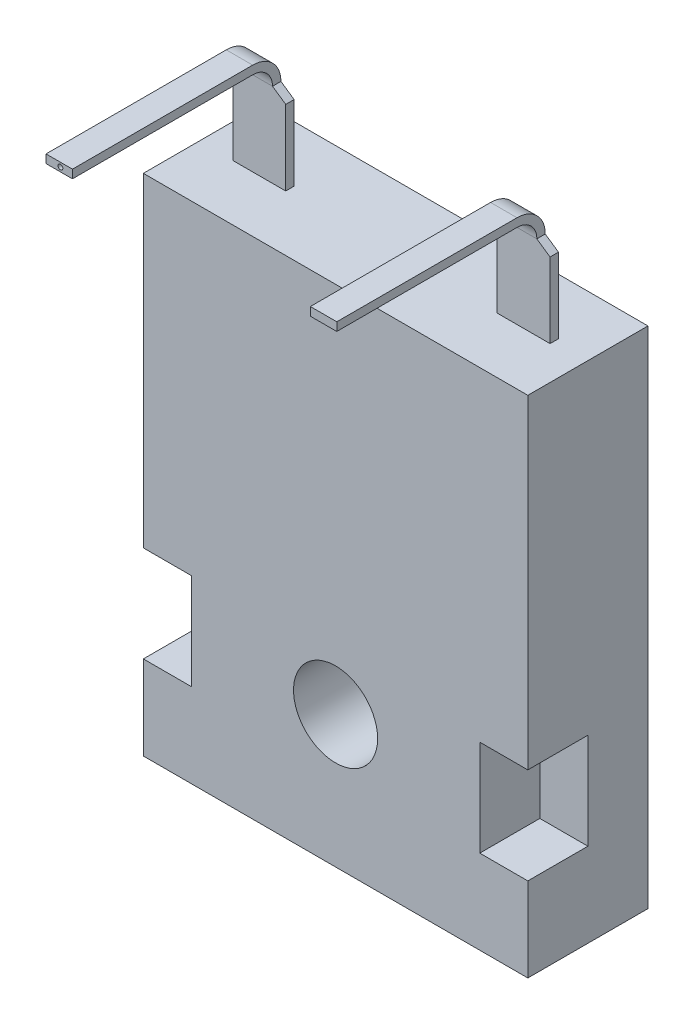
ISO-10303-21;
HEADER;
FILE_DESCRIPTION(('STEP AP214'),'2;1');
FILE_NAME('part.step','',(''),(''),'','','');
FILE_SCHEMA(('AUTOMOTIVE_DESIGN { 1 0 10303 214 1 1 1 1 }'));
ENDSEC;
DATA;
#1=APPLICATION_CONTEXT('core data for automotive mechanical design processes');
#2=APPLICATION_PROTOCOL_DEFINITION('international standard','automotive_design',2000,#1);
#3=PRODUCT_CONTEXT('',#1,'mechanical');
#4=PRODUCT('Part','Part','',(#3));
#5=PRODUCT_RELATED_PRODUCT_CATEGORY('part','',(#4));
#6=PRODUCT_DEFINITION_FORMATION('','',#4);
#7=PRODUCT_DEFINITION_CONTEXT('part definition',#1,'design');
#8=PRODUCT_DEFINITION('design','',#6,#7);
#9=PRODUCT_DEFINITION_SHAPE('','',#8);
#10=(LENGTH_UNIT() NAMED_UNIT(*) SI_UNIT(.MILLI.,.METRE.));
#11=(NAMED_UNIT(*) PLANE_ANGLE_UNIT() SI_UNIT($,.RADIAN.));
#12=(NAMED_UNIT(*) SI_UNIT($,.STERADIAN.) SOLID_ANGLE_UNIT());
#13=UNCERTAINTY_MEASURE_WITH_UNIT(LENGTH_MEASURE(1.E-05),#10,'distance_accuracy_value','');
#14=(GEOMETRIC_REPRESENTATION_CONTEXT(3) GLOBAL_UNCERTAINTY_ASSIGNED_CONTEXT((#13)) GLOBAL_UNIT_ASSIGNED_CONTEXT((#10,
#11,#12)) REPRESENTATION_CONTEXT('',''));
#15=CARTESIAN_POINT('',(0.,0.,0.));
#16=DIRECTION('',(0.,0.,1.));
#17=DIRECTION('',(1.,0.,0.));
#18=AXIS2_PLACEMENT_3D('',#15,#16,#17);
#19=CARTESIAN_POINT('',(-8.,15.5,5.));
#20=DIRECTION('',(0.,0.,-1.));
#21=DIRECTION('',(-1.,0.,0.));
#22=AXIS2_PLACEMENT_3D('',#19,#20,#21);
#23=PLANE('',#22);
#24=CARTESIAN_POINT('',(0.,0.,5.));
#25=DIRECTION('',(0.,0.,1.));
#26=DIRECTION('',(1.,0.,0.));
#27=AXIS2_PLACEMENT_3D('',#24,#25,#26);
#28=CIRCLE('',#27,1.75);
#29=CARTESIAN_POINT('',(1.75,0.,5.));
#30=VERTEX_POINT('',#29);
#31=EDGE_CURVE('E459',#30,#30,#28,.T.);
#32=ORIENTED_EDGE('',*,*,#31,.F.);
#33=EDGE_LOOP('',(#32));
#34=FACE_BOUND('',#33,.T.);
#35=DIRECTION('',(-1.,0.,0.));
#36=VECTOR('',#35,1.);
#37=CARTESIAN_POINT('',(6.,-2.,5.));
#38=LINE('',#37,#36);
#39=CARTESIAN_POINT('',(8.,-2.,5.));
#40=VERTEX_POINT('',#39);
#41=CARTESIAN_POINT('',(6.,-2.,5.));
#42=VERTEX_POINT('',#41);
#43=EDGE_CURVE('E1020',#40,#42,#38,.T.);
#44=ORIENTED_EDGE('',*,*,#43,.T.);
#45=DIRECTION('',(0.,1.,0.));
#46=VECTOR('',#45,1.);
#47=CARTESIAN_POINT('',(6.,-2.,5.));
#48=LINE('',#47,#46);
#49=CARTESIAN_POINT('',(6.,2.,5.));
#50=VERTEX_POINT('',#49);
#51=EDGE_CURVE('E258',#42,#50,#48,.T.);
#52=ORIENTED_EDGE('',*,*,#51,.T.);
#53=DIRECTION('',(1.,0.,0.));
#54=VECTOR('',#53,1.);
#55=CARTESIAN_POINT('',(6.,2.,5.));
#56=LINE('',#55,#54);
#57=CARTESIAN_POINT('',(8.,2.,5.));
#58=VERTEX_POINT('',#57);
#59=EDGE_CURVE('E247',#50,#58,#56,.T.);
#60=ORIENTED_EDGE('',*,*,#59,.T.);
#61=DIRECTION('',(0.,1.,0.));
#62=VECTOR('',#61,1.);
#63=CARTESIAN_POINT('',(8.,-5.5,5.));
#64=LINE('',#63,#62);
#65=CARTESIAN_POINT('',(8.,15.5,5.));
#66=VERTEX_POINT('',#65);
#67=EDGE_CURVE('E479',#58,#66,#64,.T.);
#68=ORIENTED_EDGE('',*,*,#67,.T.);
#69=DIRECTION('',(-1.,0.,0.));
#70=VECTOR('',#69,1.);
#71=CARTESIAN_POINT('',(-8.,15.5,5.));
#72=LINE('',#71,#70);
#73=CARTESIAN_POINT('',(-8.,15.5,5.));
#74=VERTEX_POINT('',#73);
#75=EDGE_CURVE('E466',#66,#74,#72,.T.);
#76=ORIENTED_EDGE('',*,*,#75,.T.);
#77=DIRECTION('',(0.,-1.,0.));
#78=VECTOR('',#77,1.);
#79=CARTESIAN_POINT('',(-7.99999999999999,-5.5,5.));
#80=LINE('',#79,#78);
#81=CARTESIAN_POINT('',(-7.99999999999999,2.,5.));
#82=VERTEX_POINT('',#81);
#83=EDGE_CURVE('E473',#74,#82,#80,.T.);
#84=ORIENTED_EDGE('',*,*,#83,.T.);
#85=DIRECTION('',(1.,0.,0.));
#86=VECTOR('',#85,1.);
#87=CARTESIAN_POINT('',(-6.,2.,5.));
#88=LINE('',#87,#86);
#89=CARTESIAN_POINT('',(-6.,2.,5.));
#90=VERTEX_POINT('',#89);
#91=EDGE_CURVE('E272',#82,#90,#88,.T.);
#92=ORIENTED_EDGE('',*,*,#91,.T.);
#93=DIRECTION('',(0.,-1.,0.));
#94=VECTOR('',#93,1.);
#95=CARTESIAN_POINT('',(-6.,-2.,5.));
#96=LINE('',#95,#94);
#97=CARTESIAN_POINT('',(-6.,-2.,5.));
#98=VERTEX_POINT('',#97);
#99=EDGE_CURVE('E259',#90,#98,#96,.T.);
#100=ORIENTED_EDGE('',*,*,#99,.T.);
#101=DIRECTION('',(-1.,0.,0.));
#102=VECTOR('',#101,1.);
#103=CARTESIAN_POINT('',(-6.,-2.,5.));
#104=LINE('',#103,#102);
#105=CARTESIAN_POINT('',(-7.99999999999999,-2.,5.));
#106=VERTEX_POINT('',#105);
#107=EDGE_CURVE('E263',#98,#106,#104,.T.);
#108=ORIENTED_EDGE('',*,*,#107,.T.);
#109=CARTESIAN_POINT('',(-7.99999999999999,-5.5,5.));
#110=VERTEX_POINT('',#109);
#111=EDGE_CURVE('E471',#106,#110,#80,.T.);
#112=ORIENTED_EDGE('',*,*,#111,.T.);
#113=DIRECTION('',(1.,0.,0.));
#114=VECTOR('',#113,1.);
#115=CARTESIAN_POINT('',(-7.99999999999999,-5.5,5.));
#116=LINE('',#115,#114);
#117=CARTESIAN_POINT('',(8.,-5.5,5.));
#118=VERTEX_POINT('',#117);
#119=EDGE_CURVE('E448',#110,#118,#116,.T.);
#120=ORIENTED_EDGE('',*,*,#119,.T.);
#121=EDGE_CURVE('E480',#118,#40,#64,.T.);
#122=ORIENTED_EDGE('',*,*,#121,.T.);
#123=EDGE_LOOP('',(#44,#52,#60,#68,#76,#84,#92,#100,#108,#112,#120,#122));
#124=FACE_BOUND('',#123,.T.);
#125=ADVANCED_FACE('F33',(#34,#124),#23,.F.);
#126=CARTESIAN_POINT('',(8.,-5.5,5.));
#127=DIRECTION('',(-1.,0.,0.));
#128=DIRECTION('',(0.,0.,1.));
#129=AXIS2_PLACEMENT_3D('',#126,#127,#128);
#130=PLANE('',#129);
#131=DIRECTION('',(0.,0.,-1.));
#132=VECTOR('',#131,1.);
#133=CARTESIAN_POINT('',(8.,-2.,5.));
#134=LINE('',#133,#132);
#135=CARTESIAN_POINT('',(8.,-2.,2.5));
#136=VERTEX_POINT('',#135);
#137=EDGE_CURVE('E11',#40,#136,#134,.T.);
#138=ORIENTED_EDGE('',*,*,#137,.F.);
#139=ORIENTED_EDGE('',*,*,#121,.F.);
#140=DIRECTION('',(0.,0.,-1.));
#141=VECTOR('',#140,1.);
#142=CARTESIAN_POINT('',(8.,-5.5,5.));
#143=LINE('',#142,#141);
#144=CARTESIAN_POINT('',(8.,-5.5,0.));
#145=VERTEX_POINT('',#144);
#146=EDGE_CURVE('E431',#118,#145,#143,.T.);
#147=ORIENTED_EDGE('',*,*,#146,.T.);
#148=DIRECTION('',(0.,1.,0.));
#149=VECTOR('',#148,1.);
#150=CARTESIAN_POINT('',(8.,-5.5,0.));
#151=LINE('',#150,#149);
#152=CARTESIAN_POINT('',(8.,15.5,0.));
#153=VERTEX_POINT('',#152);
#154=EDGE_CURVE('E461',#145,#153,#151,.T.);
#155=ORIENTED_EDGE('',*,*,#154,.T.);
#156=DIRECTION('',(0.,0.,-1.));
#157=VECTOR('',#156,1.);
#158=CARTESIAN_POINT('',(8.,15.5,5.));
#159=LINE('',#158,#157);
#160=EDGE_CURVE('E428',#66,#153,#159,.T.);
#161=ORIENTED_EDGE('',*,*,#160,.F.);
#162=ORIENTED_EDGE('',*,*,#67,.F.);
#163=DIRECTION('',(0.,0.,1.));
#164=VECTOR('',#163,1.);
#165=CARTESIAN_POINT('',(8.,2.,5.));
#166=LINE('',#165,#164);
#167=CARTESIAN_POINT('',(8.,2.,2.5));
#168=VERTEX_POINT('',#167);
#169=EDGE_CURVE('E41',#168,#58,#166,.T.);
#170=ORIENTED_EDGE('',*,*,#169,.F.);
#171=DIRECTION('',(0.,1.,0.));
#172=VECTOR('',#171,1.);
#173=CARTESIAN_POINT('',(8.,-5.5,2.5));
#174=LINE('',#173,#172);
#175=EDGE_CURVE('E508',#136,#168,#174,.T.);
#176=ORIENTED_EDGE('',*,*,#175,.F.);
#177=EDGE_LOOP('',(#138,#139,#147,#155,#161,#162,#170,#176));
#178=FACE_BOUND('',#177,.T.);
#179=ADVANCED_FACE('F490',(#178),#130,.F.);
#180=CARTESIAN_POINT('',(-7.99999999999999,-5.5,5.));
#181=DIRECTION('',(1.,0.,0.));
#182=DIRECTION('',(0.,1.,0.));
#183=AXIS2_PLACEMENT_3D('',#180,#181,#182);
#184=PLANE('',#183);
#185=DIRECTION('',(0.,0.,1.));
#186=VECTOR('',#185,1.);
#187=CARTESIAN_POINT('',(-7.99999999999999,-2.,5.));
#188=LINE('',#187,#186);
#189=CARTESIAN_POINT('',(-7.99999999999999,-2.,2.5));
#190=VERTEX_POINT('',#189);
#191=EDGE_CURVE('E506',#190,#106,#188,.T.);
#192=ORIENTED_EDGE('',*,*,#191,.F.);
#193=DIRECTION('',(0.,-1.,0.));
#194=VECTOR('',#193,1.);
#195=CARTESIAN_POINT('',(-7.99999999999999,-5.5,2.5));
#196=LINE('',#195,#194);
#197=CARTESIAN_POINT('',(-7.99999999999999,2.,2.5));
#198=VERTEX_POINT('',#197);
#199=EDGE_CURVE('E507',#198,#190,#196,.T.);
#200=ORIENTED_EDGE('',*,*,#199,.F.);
#201=DIRECTION('',(0.,0.,-1.));
#202=VECTOR('',#201,1.);
#203=CARTESIAN_POINT('',(-7.99999999999999,2.,5.));
#204=LINE('',#203,#202);
#205=EDGE_CURVE('E496',#82,#198,#204,.T.);
#206=ORIENTED_EDGE('',*,*,#205,.F.);
#207=ORIENTED_EDGE('',*,*,#83,.F.);
#208=DIRECTION('',(0.,0.,-1.));
#209=VECTOR('',#208,1.);
#210=CARTESIAN_POINT('',(-8.,15.5,5.));
#211=LINE('',#210,#209);
#212=CARTESIAN_POINT('',(-8.,15.5,0.));
#213=VERTEX_POINT('',#212);
#214=EDGE_CURVE('E432',#74,#213,#211,.T.);
#215=ORIENTED_EDGE('',*,*,#214,.T.);
#216=DIRECTION('',(0.,-1.,0.));
#217=VECTOR('',#216,1.);
#218=CARTESIAN_POINT('',(-7.99999999999999,-5.5,0.));
#219=LINE('',#218,#217);
#220=CARTESIAN_POINT('',(-7.99999999999999,-5.5,0.));
#221=VERTEX_POINT('',#220);
#222=EDGE_CURVE('E452',#213,#221,#219,.T.);
#223=ORIENTED_EDGE('',*,*,#222,.T.);
#224=DIRECTION('',(0.,0.,-1.));
#225=VECTOR('',#224,1.);
#226=CARTESIAN_POINT('',(-7.99999999999999,-5.5,5.));
#227=LINE('',#226,#225);
#228=EDGE_CURVE('E427',#110,#221,#227,.T.);
#229=ORIENTED_EDGE('',*,*,#228,.F.);
#230=ORIENTED_EDGE('',*,*,#111,.F.);
#231=EDGE_LOOP('',(#192,#200,#206,#207,#215,#223,#229,#230));
#232=FACE_BOUND('',#231,.T.);
#233=ADVANCED_FACE('F35',(#232),#184,.F.);
#234=CARTESIAN_POINT('',(8.,15.5,2.675));
#235=DIRECTION('',(0.,0.,1.));
#236=DIRECTION('',(1.,0.,0.));
#237=AXIS2_PLACEMENT_3D('',#234,#235,#236);
#238=PLANE('',#237);
#239=DIRECTION('',(0.824189428753906,0.566314210955642,0.));
#240=VECTOR('',#239,1.);
#241=CARTESIAN_POINT('',(1.86037376221952,24.4353488642635,2.675));
#242=LINE('',#241,#240);
#243=CARTESIAN_POINT('',(-6.6,18.6220858880749,2.675));
#244=VERTEX_POINT('',#243);
#245=CARTESIAN_POINT('',(-6.05,19.,2.675));
#246=VERTEX_POINT('',#245);
#247=EDGE_CURVE('E308',#244,#246,#242,.T.);
#248=ORIENTED_EDGE('',*,*,#247,.F.);
#249=DIRECTION('',(0.,1.,0.));
#250=VECTOR('',#249,1.);
#251=CARTESIAN_POINT('',(-6.6,15.5,2.675));
#252=LINE('',#251,#250);
#253=CARTESIAN_POINT('',(-6.6,15.5,2.675));
#254=VERTEX_POINT('',#253);
#255=EDGE_CURVE('E310',#254,#244,#252,.T.);
#256=ORIENTED_EDGE('',*,*,#255,.F.);
#257=DIRECTION('',(-1.,0.,0.));
#258=VECTOR('',#257,1.);
#259=CARTESIAN_POINT('',(8.,15.5,2.675));
#260=LINE('',#259,#258);
#261=CARTESIAN_POINT('',(-4.4,15.5,2.675));
#262=VERTEX_POINT('',#261);
#263=EDGE_CURVE('E412',#262,#254,#260,.T.);
#264=ORIENTED_EDGE('',*,*,#263,.F.);
#265=DIRECTION('',(0.,-1.,0.));
#266=VECTOR('',#265,1.);
#267=CARTESIAN_POINT('',(-4.4,15.5,2.675));
#268=LINE('',#267,#266);
#269=CARTESIAN_POINT('',(-4.4,18.6220858880749,2.675));
#270=VERTEX_POINT('',#269);
#271=EDGE_CURVE('E362',#270,#262,#268,.T.);
#272=ORIENTED_EDGE('',*,*,#271,.F.);
#273=DIRECTION('',(0.824189428753906,-0.566314210955642,0.));
#274=VECTOR('',#273,1.);
#275=CARTESIAN_POINT('',(5.48040802846209,11.8330938416493,2.675));
#276=LINE('',#275,#274);
#277=CARTESIAN_POINT('',(-4.95,19.,2.675));
#278=VERTEX_POINT('',#277);
#279=EDGE_CURVE('E360',#278,#270,#276,.T.);
#280=ORIENTED_EDGE('',*,*,#279,.F.);
#281=DIRECTION('',(-1.,0.,0.));
#282=VECTOR('',#281,1.);
#283=CARTESIAN_POINT('',(8.,19.,2.675));
#284=LINE('',#283,#282);
#285=EDGE_CURVE('E402',#278,#246,#284,.T.);
#286=ORIENTED_EDGE('',*,*,#285,.T.);
#287=EDGE_LOOP('',(#248,#256,#264,#272,#280,#286));
#288=FACE_BOUND('',#287,.T.);
#289=ADVANCED_FACE('F673',(#288),#238,.T.);
#290=CARTESIAN_POINT('',(8.,15.5,2.325));
#291=DIRECTION('',(0.,0.,1.));
#292=DIRECTION('',(1.,0.,0.));
#293=AXIS2_PLACEMENT_3D('',#290,#291,#292);
#294=PLANE('',#293);
#295=DIRECTION('',(0.,-1.,0.));
#296=VECTOR('',#295,1.);
#297=CARTESIAN_POINT('',(-6.6,18.6220858880749,2.325));
#298=LINE('',#297,#296);
#299=CARTESIAN_POINT('',(-6.6,18.6220858880749,2.325));
#300=VERTEX_POINT('',#299);
#301=CARTESIAN_POINT('',(-6.6,15.5,2.325));
#302=VERTEX_POINT('',#301);
#303=EDGE_CURVE('E288',#300,#302,#298,.T.);
#304=ORIENTED_EDGE('',*,*,#303,.F.);
#305=DIRECTION('',(-0.824189428753905,-0.566314210955641,0.));
#306=VECTOR('',#305,1.);
#307=CARTESIAN_POINT('',(-6.05,19.,2.325));
#308=LINE('',#307,#306);
#309=CARTESIAN_POINT('',(-6.05,19.,2.325));
#310=VERTEX_POINT('',#309);
#311=EDGE_CURVE('E285',#310,#300,#308,.T.);
#312=ORIENTED_EDGE('',*,*,#311,.F.);
#313=DIRECTION('',(-1.,0.,0.));
#314=VECTOR('',#313,1.);
#315=CARTESIAN_POINT('',(8.,19.,2.325));
#316=LINE('',#315,#314);
#317=CARTESIAN_POINT('',(-4.95,19.,2.325));
#318=VERTEX_POINT('',#317);
#319=EDGE_CURVE('E974',#318,#310,#316,.T.);
#320=ORIENTED_EDGE('',*,*,#319,.F.);
#321=DIRECTION('',(-0.824189428753905,0.566314210955641,0.));
#322=VECTOR('',#321,1.);
#323=CARTESIAN_POINT('',(-4.95,19.,2.325));
#324=LINE('',#323,#322);
#325=CARTESIAN_POINT('',(-4.4,18.6220858880749,2.325));
#326=VERTEX_POINT('',#325);
#327=EDGE_CURVE('E341',#326,#318,#324,.T.);
#328=ORIENTED_EDGE('',*,*,#327,.F.);
#329=DIRECTION('',(0.,1.,0.));
#330=VECTOR('',#329,1.);
#331=CARTESIAN_POINT('',(-4.4,18.6220858880749,2.325));
#332=LINE('',#331,#330);
#333=CARTESIAN_POINT('',(-4.4,15.5,2.325));
#334=VERTEX_POINT('',#333);
#335=EDGE_CURVE('E338',#334,#326,#332,.T.);
#336=ORIENTED_EDGE('',*,*,#335,.F.);
#337=DIRECTION('',(-1.,0.,0.));
#338=VECTOR('',#337,1.);
#339=CARTESIAN_POINT('',(8.,15.5,2.325));
#340=LINE('',#339,#338);
#341=EDGE_CURVE('E416',#334,#302,#340,.T.);
#342=ORIENTED_EDGE('',*,*,#341,.T.);
#343=EDGE_LOOP('',(#304,#312,#320,#328,#336,#342));
#344=FACE_BOUND('',#343,.T.);
#345=ADVANCED_FACE('F867',(#344),#294,.F.);
#346=CARTESIAN_POINT('',(8.,19.825,3.50000000000001));
#347=DIRECTION('',(0.,-1.,0.));
#348=DIRECTION('',(1.,0.,0.));
#349=AXIS2_PLACEMENT_3D('',#346,#347,#348);
#350=PLANE('',#349);
#351=DIRECTION('',(0.,0.,-1.));
#352=VECTOR('',#351,1.);
#353=CARTESIAN_POINT('',(6.05,19.825,3.50000000000001));
#354=LINE('',#353,#352);
#355=CARTESIAN_POINT('',(6.05,19.825,11.));
#356=VERTEX_POINT('',#355);
#357=CARTESIAN_POINT('',(6.05,19.825,3.50000000000001));
#358=VERTEX_POINT('',#357);
#359=EDGE_CURVE('E332',#356,#358,#354,.T.);
#360=ORIENTED_EDGE('',*,*,#359,.F.);
#361=DIRECTION('',(-1.,0.,0.));
#362=VECTOR('',#361,1.);
#363=CARTESIAN_POINT('',(8.,19.825,11.));
#364=LINE('',#363,#362);
#365=CARTESIAN_POINT('',(4.95,19.825,11.));
#366=VERTEX_POINT('',#365);
#367=EDGE_CURVE('E982',#356,#366,#364,.T.);
#368=ORIENTED_EDGE('',*,*,#367,.T.);
#369=DIRECTION('',(0.,0.,1.));
#370=VECTOR('',#369,1.);
#371=CARTESIAN_POINT('',(4.95,19.825,3.50000000000001));
#372=LINE('',#371,#370);
#373=CARTESIAN_POINT('',(4.95,19.825,3.50000000000001));
#374=VERTEX_POINT('',#373);
#375=EDGE_CURVE('E384',#374,#366,#372,.T.);
#376=ORIENTED_EDGE('',*,*,#375,.F.);
#377=DIRECTION('',(-1.,0.,0.));
#378=VECTOR('',#377,1.);
#379=CARTESIAN_POINT('',(8.,19.825,3.50000000000001));
#380=LINE('',#379,#378);
#381=EDGE_CURVE('E396',#358,#374,#380,.T.);
#382=ORIENTED_EDGE('',*,*,#381,.F.);
#383=EDGE_LOOP('',(#360,#368,#376,#382));
#384=FACE_BOUND('',#383,.T.);
#385=ADVANCED_FACE('F535',(#384),#350,.T.);
#386=CARTESIAN_POINT('',(8.,19.,3.5));
#387=DIRECTION('',(-1.,0.,0.));
#388=DIRECTION('',(0.,-1.,0.));
#389=AXIS2_PLACEMENT_3D('',#386,#387,#388);
#390=CYLINDRICAL_SURFACE('',#389,0.825);
#391=CARTESIAN_POINT('',(6.05,19.,3.5));
#392=DIRECTION('',(-1.,0.,0.));
#393=DIRECTION('',(0.,0.,1.));
#394=AXIS2_PLACEMENT_3D('',#391,#392,#393);
#395=CIRCLE('',#394,0.825);
#396=CARTESIAN_POINT('',(6.05,19.,2.675));
#397=VERTEX_POINT('',#396);
#398=EDGE_CURVE('E334',#358,#397,#395,.T.);
#399=ORIENTED_EDGE('',*,*,#398,.F.);
#400=ORIENTED_EDGE('',*,*,#381,.T.);
#401=CARTESIAN_POINT('',(4.95,19.,3.5));
#402=DIRECTION('',(1.,0.,0.));
#403=DIRECTION('',(0.,0.,-1.));
#404=AXIS2_PLACEMENT_3D('',#401,#402,#403);
#405=CIRCLE('',#404,0.825);
#406=CARTESIAN_POINT('',(4.95,19.,2.675));
#407=VERTEX_POINT('',#406);
#408=EDGE_CURVE('E387',#407,#374,#405,.T.);
#409=ORIENTED_EDGE('',*,*,#408,.F.);
#410=EDGE_CURVE('E400',#397,#407,#284,.T.);
#411=ORIENTED_EDGE('',*,*,#410,.F.);
#412=EDGE_LOOP('',(#399,#400,#409,#411));
#413=FACE_BOUND('',#412,.T.);
#414=ADVANCED_FACE('F826',(#413),#390,.F.);
#415=DIRECTION('',(0.824189428753906,-0.566314210955642,0.));
#416=VECTOR('',#415,1.);
#417=CARTESIAN_POINT('',(9.00823766929551,16.9673458878995,2.675));
#418=LINE('',#417,#416);
#419=CARTESIAN_POINT('',(6.6,18.6220858880749,2.675));
#420=VERTEX_POINT('',#419);
#421=EDGE_CURVE('E336',#397,#420,#418,.T.);
#422=ORIENTED_EDGE('',*,*,#421,.F.);
#423=ORIENTED_EDGE('',*,*,#410,.T.);
#424=DIRECTION('',(0.824189428753906,0.566314210955642,0.));
#425=VECTOR('',#424,1.);
#426=CARTESIAN_POINT('',(5.38820340305294,19.3010968180133,2.675));
#427=LINE('',#426,#425);
#428=CARTESIAN_POINT('',(4.4,18.6220858880749,2.675));
#429=VERTEX_POINT('',#428);
#430=EDGE_CURVE('E390',#429,#407,#427,.T.);
#431=ORIENTED_EDGE('',*,*,#430,.F.);
#432=DIRECTION('',(0.,1.,0.));
#433=VECTOR('',#432,1.);
#434=CARTESIAN_POINT('',(4.4,15.5,2.675));
#435=LINE('',#434,#433);
#436=CARTESIAN_POINT('',(4.4,15.5,2.675));
#437=VERTEX_POINT('',#436);
#438=EDGE_CURVE('E393',#437,#429,#435,.T.);
#439=ORIENTED_EDGE('',*,*,#438,.F.);
#440=CARTESIAN_POINT('',(6.6,15.5,2.675));
#441=VERTEX_POINT('',#440);
#442=EDGE_CURVE('E409',#441,#437,#260,.T.);
#443=ORIENTED_EDGE('',*,*,#442,.F.);
#444=DIRECTION('',(0.,-1.,0.));
#445=VECTOR('',#444,1.);
#446=CARTESIAN_POINT('',(6.6,15.5,2.675));
#447=LINE('',#446,#445);
#448=EDGE_CURVE('E321',#420,#441,#447,.T.);
#449=ORIENTED_EDGE('',*,*,#448,.F.);
#450=EDGE_LOOP('',(#422,#423,#431,#439,#443,#449));
#451=FACE_BOUND('',#450,.T.);
#452=ADVANCED_FACE('F864',(#451),#238,.T.);
#453=CARTESIAN_POINT('',(6.05,19.,2.325));
#454=VERTEX_POINT('',#453);
#455=CARTESIAN_POINT('',(4.95,19.,2.325));
#456=VERTEX_POINT('',#455);
#457=EDGE_CURVE('E419',#454,#456,#316,.T.);
#458=ORIENTED_EDGE('',*,*,#457,.F.);
#459=DIRECTION('',(-0.824189428753905,0.566314210955641,0.));
#460=VECTOR('',#459,1.);
#461=CARTESIAN_POINT('',(6.05,19.,2.325));
#462=LINE('',#461,#460);
#463=CARTESIAN_POINT('',(6.6,18.6220858880749,2.325));
#464=VERTEX_POINT('',#463);
#465=EDGE_CURVE('E312',#464,#454,#462,.T.);
#466=ORIENTED_EDGE('',*,*,#465,.F.);
#467=DIRECTION('',(0.,1.,0.));
#468=VECTOR('',#467,1.);
#469=CARTESIAN_POINT('',(6.6,18.6220858880749,2.325));
#470=LINE('',#469,#468);
#471=CARTESIAN_POINT('',(6.6,15.5,2.325));
#472=VERTEX_POINT('',#471);
#473=EDGE_CURVE('E315',#472,#464,#470,.T.);
#474=ORIENTED_EDGE('',*,*,#473,.F.);
#475=CARTESIAN_POINT('',(4.4,15.5,2.325));
#476=VERTEX_POINT('',#475);
#477=EDGE_CURVE('E415',#472,#476,#340,.T.);
#478=ORIENTED_EDGE('',*,*,#477,.T.);
#479=DIRECTION('',(0.,-1.,0.));
#480=VECTOR('',#479,1.);
#481=CARTESIAN_POINT('',(4.4,18.6220858880749,2.325));
#482=LINE('',#481,#480);
#483=CARTESIAN_POINT('',(4.4,18.6220858880749,2.325));
#484=VERTEX_POINT('',#483);
#485=EDGE_CURVE('E367',#484,#476,#482,.T.);
#486=ORIENTED_EDGE('',*,*,#485,.F.);
#487=DIRECTION('',(-0.824189428753905,-0.566314210955641,0.));
#488=VECTOR('',#487,1.);
#489=CARTESIAN_POINT('',(4.95,19.,2.325));
#490=LINE('',#489,#488);
#491=EDGE_CURVE('E364',#456,#484,#490,.T.);
#492=ORIENTED_EDGE('',*,*,#491,.F.);
#493=EDGE_LOOP('',(#458,#466,#474,#478,#486,#492));
#494=FACE_BOUND('',#493,.T.);
#495=ADVANCED_FACE('F855',(#494),#294,.F.);
#496=CARTESIAN_POINT('',(8.,19.,3.5));
#497=DIRECTION('',(-1.,0.,0.));
#498=DIRECTION('',(0.,-1.,0.));
#499=AXIS2_PLACEMENT_3D('',#496,#497,#498);
#500=CYLINDRICAL_SURFACE('',#499,1.175);
#501=DIRECTION('',(-1.,0.,0.));
#502=VECTOR('',#501,1.);
#503=CARTESIAN_POINT('',(8.,20.175,3.50000000000001));
#504=LINE('',#503,#502);
#505=CARTESIAN_POINT('',(6.05,20.175,3.50000000000001));
#506=VERTEX_POINT('',#505);
#507=CARTESIAN_POINT('',(4.95,20.175,3.50000000000001));
#508=VERTEX_POINT('',#507);
#509=EDGE_CURVE('E976',#506,#508,#504,.T.);
#510=ORIENTED_EDGE('',*,*,#509,.F.);
#511=CARTESIAN_POINT('',(6.05,19.,3.5));
#512=DIRECTION('',(-1.,0.,0.));
#513=DIRECTION('',(0.,0.,1.));
#514=AXIS2_PLACEMENT_3D('',#511,#512,#513);
#515=CIRCLE('',#514,1.175);
#516=EDGE_CURVE('E329',#506,#454,#515,.T.);
#517=ORIENTED_EDGE('',*,*,#516,.T.);
#518=ORIENTED_EDGE('',*,*,#457,.T.);
#519=CARTESIAN_POINT('',(4.95,19.,3.5));
#520=DIRECTION('',(1.,0.,0.));
#521=DIRECTION('',(0.,0.,-1.));
#522=AXIS2_PLACEMENT_3D('',#519,#520,#521);
#523=CIRCLE('',#522,1.175);
#524=EDGE_CURVE('E381',#456,#508,#523,.T.);
#525=ORIENTED_EDGE('',*,*,#524,.T.);
#526=EDGE_LOOP('',(#510,#517,#518,#525));
#527=FACE_BOUND('',#526,.T.);
#528=ADVANCED_FACE('F816',(#527),#500,.T.);
#529=CARTESIAN_POINT('',(8.,20.175,3.50000000000001));
#530=DIRECTION('',(0.,-1.,0.));
#531=DIRECTION('',(1.,0.,0.));
#532=AXIS2_PLACEMENT_3D('',#529,#530,#531);
#533=PLANE('',#532);
#534=DIRECTION('',(-1.,0.,0.));
#535=VECTOR('',#534,1.);
#536=CARTESIAN_POINT('',(8.,20.175,11.));
#537=LINE('',#536,#535);
#538=CARTESIAN_POINT('',(6.05,20.175,11.));
#539=VERTEX_POINT('',#538);
#540=CARTESIAN_POINT('',(4.95,20.175,11.));
#541=VERTEX_POINT('',#540);
#542=EDGE_CURVE('E980',#539,#541,#537,.T.);
#543=ORIENTED_EDGE('',*,*,#542,.F.);
#544=DIRECTION('',(0.,0.,-1.));
#545=VECTOR('',#544,1.);
#546=CARTESIAN_POINT('',(6.05,20.175,3.50000000000001));
#547=LINE('',#546,#545);
#548=EDGE_CURVE('E326',#539,#506,#547,.T.);
#549=ORIENTED_EDGE('',*,*,#548,.T.);
#550=ORIENTED_EDGE('',*,*,#509,.T.);
#551=DIRECTION('',(0.,0.,1.));
#552=VECTOR('',#551,1.);
#553=CARTESIAN_POINT('',(4.95,20.175,3.50000000000001));
#554=LINE('',#553,#552);
#555=EDGE_CURVE('E374',#508,#541,#554,.T.);
#556=ORIENTED_EDGE('',*,*,#555,.T.);
#557=EDGE_LOOP('',(#543,#549,#550,#556));
#558=FACE_BOUND('',#557,.T.);
#559=ADVANCED_FACE('F806',(#558),#533,.F.);
#560=CARTESIAN_POINT('',(8.,20.175,11.));
#561=DIRECTION('',(0.,0.,-1.));
#562=DIRECTION('',(-1.,0.,0.));
#563=AXIS2_PLACEMENT_3D('',#560,#561,#562);
#564=PLANE('',#563);
#565=ORIENTED_EDGE('',*,*,#367,.F.);
#566=DIRECTION('',(0.,1.,0.));
#567=VECTOR('',#566,1.);
#568=CARTESIAN_POINT('',(6.05,20.175,11.));
#569=LINE('',#568,#567);
#570=EDGE_CURVE('E423',#356,#539,#569,.T.);
#571=ORIENTED_EDGE('',*,*,#570,.T.);
#572=ORIENTED_EDGE('',*,*,#542,.T.);
#573=DIRECTION('',(0.,-1.,0.));
#574=VECTOR('',#573,1.);
#575=CARTESIAN_POINT('',(4.95,20.175,11.));
#576=LINE('',#575,#574);
#577=EDGE_CURVE('E424',#541,#366,#576,.T.);
#578=ORIENTED_EDGE('',*,*,#577,.T.);
#579=EDGE_LOOP('',(#565,#571,#572,#578));
#580=FACE_BOUND('',#579,.T.);
#581=ADVANCED_FACE('F518',(#580),#564,.F.);
#582=CARTESIAN_POINT('',(-8.,15.5,0.));
#583=DIRECTION('',(0.,0.,-1.));
#584=DIRECTION('',(-1.,0.,0.));
#585=AXIS2_PLACEMENT_3D('',#582,#583,#584);
#586=PLANE('',#585);
#587=ORIENTED_EDGE('',*,*,#222,.F.);
#588=DIRECTION('',(-1.,0.,0.));
#589=VECTOR('',#588,1.);
#590=CARTESIAN_POINT('',(-8.,15.5,0.));
#591=LINE('',#590,#589);
#592=EDGE_CURVE('E470',#153,#213,#591,.T.);
#593=ORIENTED_EDGE('',*,*,#592,.F.);
#594=ORIENTED_EDGE('',*,*,#154,.F.);
#595=DIRECTION('',(1.,0.,0.));
#596=VECTOR('',#595,1.);
#597=CARTESIAN_POINT('',(-7.99999999999999,-5.5,0.));
#598=LINE('',#597,#596);
#599=EDGE_CURVE('E447',#221,#145,#598,.T.);
#600=ORIENTED_EDGE('',*,*,#599,.F.);
#601=EDGE_LOOP('',(#587,#593,#594,#600));
#602=FACE_BOUND('',#601,.T.);
#603=CARTESIAN_POINT('',(0.,0.,0.));
#604=DIRECTION('',(0.,0.,1.));
#605=DIRECTION('',(1.,0.,0.));
#606=AXIS2_PLACEMENT_3D('',#603,#604,#605);
#607=CIRCLE('',#606,1.75);
#608=CARTESIAN_POINT('',(1.75,0.,0.));
#609=VERTEX_POINT('',#608);
#610=EDGE_CURVE('E398',#609,#609,#607,.T.);
#611=ORIENTED_EDGE('',*,*,#610,.T.);
#612=EDGE_LOOP('',(#611));
#613=FACE_BOUND('',#612,.T.);
#614=ADVANCED_FACE('F515',(#602,#613),#586,.T.);
#615=CARTESIAN_POINT('',(-7.99999999999999,-5.5,5.));
#616=DIRECTION('',(0.,1.,0.));
#617=DIRECTION('',(0.,0.,1.));
#618=AXIS2_PLACEMENT_3D('',#615,#616,#617);
#619=PLANE('',#618);
#620=ORIENTED_EDGE('',*,*,#599,.T.);
#621=ORIENTED_EDGE('',*,*,#146,.F.);
#622=ORIENTED_EDGE('',*,*,#119,.F.);
#623=ORIENTED_EDGE('',*,*,#228,.T.);
#624=EDGE_LOOP('',(#620,#621,#622,#623));
#625=FACE_BOUND('',#624,.T.);
#626=ADVANCED_FACE('F445',(#625),#619,.F.);
#627=CARTESIAN_POINT('',(-8.,15.5,5.));
#628=DIRECTION('',(0.,-1.,0.));
#629=DIRECTION('',(0.,0.,-1.));
#630=AXIS2_PLACEMENT_3D('',#627,#628,#629);
#631=PLANE('',#630);
#632=ORIENTED_EDGE('',*,*,#214,.F.);
#633=ORIENTED_EDGE('',*,*,#75,.F.);
#634=ORIENTED_EDGE('',*,*,#160,.T.);
#635=ORIENTED_EDGE('',*,*,#592,.T.);
#636=EDGE_LOOP('',(#632,#633,#634,#635));
#637=FACE_BOUND('',#636,.T.);
#638=DIRECTION('',(0.,0.,-1.));
#639=VECTOR('',#638,1.);
#640=CARTESIAN_POINT('',(6.6,15.5,18.325));
#641=LINE('',#640,#639);
#642=EDGE_CURVE('E322',#441,#472,#641,.T.);
#643=ORIENTED_EDGE('',*,*,#642,.F.);
#644=ORIENTED_EDGE('',*,*,#442,.T.);
#645=DIRECTION('',(0.,0.,-1.));
#646=VECTOR('',#645,1.);
#647=CARTESIAN_POINT('',(4.4,15.5,18.325));
#648=LINE('',#647,#646);
#649=EDGE_CURVE('E371',#437,#476,#648,.T.);
#650=ORIENTED_EDGE('',*,*,#649,.T.);
#651=ORIENTED_EDGE('',*,*,#477,.F.);
#652=EDGE_LOOP('',(#643,#644,#650,#651));
#653=FACE_BOUND('',#652,.T.);
#654=ORIENTED_EDGE('',*,*,#263,.T.);
#655=DIRECTION('',(0.,0.,-1.));
#656=VECTOR('',#655,1.);
#657=CARTESIAN_POINT('',(-6.6,15.5,18.325));
#658=LINE('',#657,#656);
#659=EDGE_CURVE('E296',#254,#302,#658,.T.);
#660=ORIENTED_EDGE('',*,*,#659,.T.);
#661=ORIENTED_EDGE('',*,*,#341,.F.);
#662=DIRECTION('',(0.,0.,-1.));
#663=VECTOR('',#662,1.);
#664=CARTESIAN_POINT('',(-4.4,15.5,18.325));
#665=LINE('',#664,#663);
#666=EDGE_CURVE('E344',#262,#334,#665,.T.);
#667=ORIENTED_EDGE('',*,*,#666,.F.);
#668=EDGE_LOOP('',(#654,#660,#661,#667));
#669=FACE_BOUND('',#668,.T.);
#670=ADVANCED_FACE('F492',(#637,#653,#669),#631,.F.);
#671=CARTESIAN_POINT('',(0.,0.,5.));
#672=DIRECTION('',(0.,0.,-1.));
#673=DIRECTION('',(-1.,0.,0.));
#674=AXIS2_PLACEMENT_3D('',#671,#672,#673);
#675=CYLINDRICAL_SURFACE('',#674,1.75);
#676=ORIENTED_EDGE('',*,*,#31,.T.);
#677=EDGE_LOOP('',(#676));
#678=FACE_BOUND('',#677,.T.);
#679=ORIENTED_EDGE('',*,*,#610,.F.);
#680=EDGE_LOOP('',(#679));
#681=FACE_BOUND('',#680,.T.);
#682=ADVANCED_FACE('F523',(#678,#681),#675,.F.);
#683=DIRECTION('',(0.,0.,1.));
#684=VECTOR('',#683,1.);
#685=CARTESIAN_POINT('',(-6.05,19.825,3.50000000000001));
#686=LINE('',#685,#684);
#687=CARTESIAN_POINT('',(-6.05,19.825,3.50000000000001));
#688=VERTEX_POINT('',#687);
#689=CARTESIAN_POINT('',(-6.05,19.825,11.));
#690=VERTEX_POINT('',#689);
#691=EDGE_CURVE('E304',#688,#690,#686,.T.);
#692=ORIENTED_EDGE('',*,*,#691,.F.);
#693=CARTESIAN_POINT('',(-4.95,19.825,3.50000000000001));
#694=VERTEX_POINT('',#693);
#695=EDGE_CURVE('E399',#694,#688,#380,.T.);
#696=ORIENTED_EDGE('',*,*,#695,.F.);
#697=DIRECTION('',(0.,0.,-1.));
#698=VECTOR('',#697,1.);
#699=CARTESIAN_POINT('',(-4.95,19.825,3.50000000000001));
#700=LINE('',#699,#698);
#701=CARTESIAN_POINT('',(-4.95,19.825,11.));
#702=VERTEX_POINT('',#701);
#703=EDGE_CURVE('E356',#702,#694,#700,.T.);
#704=ORIENTED_EDGE('',*,*,#703,.F.);
#705=EDGE_CURVE('E395',#702,#690,#364,.T.);
#706=ORIENTED_EDGE('',*,*,#705,.T.);
#707=EDGE_LOOP('',(#692,#696,#704,#706));
#708=FACE_BOUND('',#707,.T.);
#709=ADVANCED_FACE('F525',(#708),#350,.T.);
#710=CARTESIAN_POINT('',(-6.05,19.,3.5));
#711=DIRECTION('',(1.,0.,0.));
#712=DIRECTION('',(0.,0.,-1.));
#713=AXIS2_PLACEMENT_3D('',#710,#711,#712);
#714=CIRCLE('',#713,0.825);
#715=EDGE_CURVE('E306',#246,#688,#714,.T.);
#716=ORIENTED_EDGE('',*,*,#715,.F.);
#717=ORIENTED_EDGE('',*,*,#285,.F.);
#718=CARTESIAN_POINT('',(-4.95,19.,3.5));
#719=DIRECTION('',(-1.,0.,0.));
#720=DIRECTION('',(0.,0.,1.));
#721=AXIS2_PLACEMENT_3D('',#718,#719,#720);
#722=CIRCLE('',#721,0.825);
#723=EDGE_CURVE('E358',#694,#278,#722,.T.);
#724=ORIENTED_EDGE('',*,*,#723,.F.);
#725=ORIENTED_EDGE('',*,*,#695,.T.);
#726=EDGE_LOOP('',(#716,#717,#724,#725));
#727=FACE_BOUND('',#726,.T.);
#728=ADVANCED_FACE('F532',(#727),#390,.F.);
#729=ORIENTED_EDGE('',*,*,#319,.T.);
#730=CARTESIAN_POINT('',(-6.05,19.,3.5));
#731=DIRECTION('',(1.,0.,0.));
#732=DIRECTION('',(0.,0.,-1.));
#733=AXIS2_PLACEMENT_3D('',#730,#731,#732);
#734=CIRCLE('',#733,1.175);
#735=CARTESIAN_POINT('',(-6.05,20.175,3.50000000000001));
#736=VERTEX_POINT('',#735);
#737=EDGE_CURVE('E301',#310,#736,#734,.T.);
#738=ORIENTED_EDGE('',*,*,#737,.T.);
#739=CARTESIAN_POINT('',(-4.95,20.175,3.50000000000001));
#740=VERTEX_POINT('',#739);
#741=EDGE_CURVE('E979',#740,#736,#504,.T.);
#742=ORIENTED_EDGE('',*,*,#741,.F.);
#743=CARTESIAN_POINT('',(-4.95,19.,3.5));
#744=DIRECTION('',(-1.,0.,0.));
#745=DIRECTION('',(0.,0.,1.));
#746=AXIS2_PLACEMENT_3D('',#743,#744,#745);
#747=CIRCLE('',#746,1.175);
#748=EDGE_CURVE('E353',#740,#318,#747,.T.);
#749=ORIENTED_EDGE('',*,*,#748,.T.);
#750=EDGE_LOOP('',(#729,#738,#742,#749));
#751=FACE_BOUND('',#750,.T.);
#752=ADVANCED_FACE('F803',(#751),#500,.T.);
#753=ORIENTED_EDGE('',*,*,#741,.T.);
#754=DIRECTION('',(0.,0.,1.));
#755=VECTOR('',#754,1.);
#756=CARTESIAN_POINT('',(-6.05,20.175,3.50000000000001));
#757=LINE('',#756,#755);
#758=CARTESIAN_POINT('',(-6.05,20.175,11.));
#759=VERTEX_POINT('',#758);
#760=EDGE_CURVE('E295',#736,#759,#757,.T.);
#761=ORIENTED_EDGE('',*,*,#760,.T.);
#762=CARTESIAN_POINT('',(-4.95,20.175,11.));
#763=VERTEX_POINT('',#762);
#764=EDGE_CURVE('E955',#763,#759,#537,.T.);
#765=ORIENTED_EDGE('',*,*,#764,.F.);
#766=DIRECTION('',(0.,0.,-1.));
#767=VECTOR('',#766,1.);
#768=CARTESIAN_POINT('',(-4.95,20.175,3.50000000000001));
#769=LINE('',#768,#767);
#770=EDGE_CURVE('E347',#763,#740,#769,.T.);
#771=ORIENTED_EDGE('',*,*,#770,.T.);
#772=EDGE_LOOP('',(#753,#761,#765,#771));
#773=FACE_BOUND('',#772,.T.);
#774=ADVANCED_FACE('F595',(#773),#533,.F.);
#775=CARTESIAN_POINT('',(-5.45,20.,11.));
#776=DIRECTION('',(0.,0.,1.));
#777=DIRECTION('',(1.,0.,0.));
#778=AXIS2_PLACEMENT_3D('',#775,#776,#777);
#779=CIRCLE('',#778,0.1);
#780=CARTESIAN_POINT('',(-5.35,20.,11.));
#781=VERTEX_POINT('',#780);
#782=EDGE_CURVE('E1015',#781,#781,#779,.T.);
#783=ORIENTED_EDGE('',*,*,#782,.F.);
#784=EDGE_LOOP('',(#783));
#785=FACE_BOUND('',#784,.T.);
#786=ORIENTED_EDGE('',*,*,#764,.T.);
#787=DIRECTION('',(0.,-1.,0.));
#788=VECTOR('',#787,1.);
#789=CARTESIAN_POINT('',(-6.05,20.175,11.));
#790=LINE('',#789,#788);
#791=EDGE_CURVE('E951',#759,#690,#790,.T.);
#792=ORIENTED_EDGE('',*,*,#791,.T.);
#793=ORIENTED_EDGE('',*,*,#705,.F.);
#794=DIRECTION('',(0.,1.,0.));
#795=VECTOR('',#794,1.);
#796=CARTESIAN_POINT('',(-4.95,20.175,11.));
#797=LINE('',#796,#795);
#798=EDGE_CURVE('E420',#702,#763,#797,.T.);
#799=ORIENTED_EDGE('',*,*,#798,.T.);
#800=EDGE_LOOP('',(#786,#792,#793,#799));
#801=FACE_BOUND('',#800,.T.);
#802=ADVANCED_FACE('F589',(#785,#801),#564,.F.);
#803=CARTESIAN_POINT('',(4.4,18.6220858880749,18.325));
#804=DIRECTION('',(1.,0.,0.));
#805=DIRECTION('',(0.,0.,-1.));
#806=AXIS2_PLACEMENT_3D('',#803,#804,#805);
#807=PLANE('',#806);
#808=ORIENTED_EDGE('',*,*,#438,.T.);
#809=DIRECTION('',(0.,0.,-1.));
#810=VECTOR('',#809,1.);
#811=CARTESIAN_POINT('',(4.4,18.6220858880749,18.325));
#812=LINE('',#811,#810);
#813=EDGE_CURVE('E375',#429,#484,#812,.T.);
#814=ORIENTED_EDGE('',*,*,#813,.T.);
#815=ORIENTED_EDGE('',*,*,#485,.T.);
#816=ORIENTED_EDGE('',*,*,#649,.F.);
#817=EDGE_LOOP('',(#808,#814,#815,#816));
#818=FACE_BOUND('',#817,.T.);
#819=ADVANCED_FACE('F594',(#818),#807,.F.);
#820=CARTESIAN_POINT('',(4.95,19.,18.325));
#821=DIRECTION('',(0.566314210955642,-0.824189428753906,0.));
#822=DIRECTION('',(0.824189428753906,0.566314210955642,0.));
#823=AXIS2_PLACEMENT_3D('',#820,#821,#822);
#824=PLANE('',#823);
#825=ORIENTED_EDGE('',*,*,#430,.T.);
#826=DIRECTION('',(0.,0.,-1.));
#827=VECTOR('',#826,1.);
#828=CARTESIAN_POINT('',(4.95,19.,18.325));
#829=LINE('',#828,#827);
#830=EDGE_CURVE('E370',#407,#456,#829,.T.);
#831=ORIENTED_EDGE('',*,*,#830,.T.);
#832=ORIENTED_EDGE('',*,*,#491,.T.);
#833=ORIENTED_EDGE('',*,*,#813,.F.);
#834=EDGE_LOOP('',(#825,#831,#832,#833));
#835=FACE_BOUND('',#834,.T.);
#836=ADVANCED_FACE('F778',(#835),#824,.F.);
#837=CARTESIAN_POINT('',(4.95,19.,18.325));
#838=DIRECTION('',(1.,0.,0.));
#839=DIRECTION('',(0.,0.,-1.));
#840=AXIS2_PLACEMENT_3D('',#837,#838,#839);
#841=PLANE('',#840);
#842=ORIENTED_EDGE('',*,*,#408,.T.);
#843=ORIENTED_EDGE('',*,*,#375,.T.);
#844=ORIENTED_EDGE('',*,*,#577,.F.);
#845=ORIENTED_EDGE('',*,*,#555,.F.);
#846=ORIENTED_EDGE('',*,*,#524,.F.);
#847=ORIENTED_EDGE('',*,*,#830,.F.);
#848=EDGE_LOOP('',(#842,#843,#844,#845,#846,#847));
#849=FACE_BOUND('',#848,.T.);
#850=ADVANCED_FACE('F768',(#849),#841,.F.);
#851=CARTESIAN_POINT('',(-4.95,19.,18.325));
#852=DIRECTION('',(-1.,0.,0.));
#853=DIRECTION('',(0.,0.,1.));
#854=AXIS2_PLACEMENT_3D('',#851,#852,#853);
#855=PLANE('',#854);
#856=ORIENTED_EDGE('',*,*,#723,.T.);
#857=DIRECTION('',(0.,0.,-1.));
#858=VECTOR('',#857,1.);
#859=CARTESIAN_POINT('',(-4.95,19.,18.325));
#860=LINE('',#859,#858);
#861=EDGE_CURVE('E345',#278,#318,#860,.T.);
#862=ORIENTED_EDGE('',*,*,#861,.T.);
#863=ORIENTED_EDGE('',*,*,#748,.F.);
#864=ORIENTED_EDGE('',*,*,#770,.F.);
#865=ORIENTED_EDGE('',*,*,#798,.F.);
#866=ORIENTED_EDGE('',*,*,#703,.T.);
#867=EDGE_LOOP('',(#856,#862,#863,#864,#865,#866));
#868=FACE_BOUND('',#867,.T.);
#869=ADVANCED_FACE('F758',(#868),#855,.F.);
#870=CARTESIAN_POINT('',(-4.95,19.,18.325));
#871=DIRECTION('',(-0.566314210955642,-0.824189428753906,0.));
#872=DIRECTION('',(0.824189428753906,-0.566314210955642,0.));
#873=AXIS2_PLACEMENT_3D('',#870,#871,#872);
#874=PLANE('',#873);
#875=ORIENTED_EDGE('',*,*,#279,.T.);
#876=DIRECTION('',(0.,0.,-1.));
#877=VECTOR('',#876,1.);
#878=CARTESIAN_POINT('',(-4.4,18.6220858880749,18.325));
#879=LINE('',#878,#877);
#880=EDGE_CURVE('E348',#270,#326,#879,.T.);
#881=ORIENTED_EDGE('',*,*,#880,.T.);
#882=ORIENTED_EDGE('',*,*,#327,.T.);
#883=ORIENTED_EDGE('',*,*,#861,.F.);
#884=EDGE_LOOP('',(#875,#881,#882,#883));
#885=FACE_BOUND('',#884,.T.);
#886=ADVANCED_FACE('F748',(#885),#874,.F.);
#887=CARTESIAN_POINT('',(-4.4,18.6220858880749,18.325));
#888=DIRECTION('',(-1.,0.,0.));
#889=DIRECTION('',(0.,0.,1.));
#890=AXIS2_PLACEMENT_3D('',#887,#888,#889);
#891=PLANE('',#890);
#892=ORIENTED_EDGE('',*,*,#271,.T.);
#893=ORIENTED_EDGE('',*,*,#666,.T.);
#894=ORIENTED_EDGE('',*,*,#335,.T.);
#895=ORIENTED_EDGE('',*,*,#880,.F.);
#896=EDGE_LOOP('',(#892,#893,#894,#895));
#897=FACE_BOUND('',#896,.T.);
#898=ADVANCED_FACE('F738',(#897),#891,.F.);
#899=CARTESIAN_POINT('',(6.05,19.,18.325));
#900=DIRECTION('',(-0.566314210955642,-0.824189428753906,0.));
#901=DIRECTION('',(0.824189428753906,-0.566314210955642,0.));
#902=AXIS2_PLACEMENT_3D('',#899,#900,#901);
#903=PLANE('',#902);
#904=ORIENTED_EDGE('',*,*,#421,.T.);
#905=DIRECTION('',(0.,0.,-1.));
#906=VECTOR('',#905,1.);
#907=CARTESIAN_POINT('',(6.6,18.6220858880749,18.325));
#908=LINE('',#907,#906);
#909=EDGE_CURVE('E319',#420,#464,#908,.T.);
#910=ORIENTED_EDGE('',*,*,#909,.T.);
#911=ORIENTED_EDGE('',*,*,#465,.T.);
#912=DIRECTION('',(0.,0.,-1.));
#913=VECTOR('',#912,1.);
#914=CARTESIAN_POINT('',(6.05,19.,18.325));
#915=LINE('',#914,#913);
#916=EDGE_CURVE('E318',#397,#454,#915,.T.);
#917=ORIENTED_EDGE('',*,*,#916,.F.);
#918=EDGE_LOOP('',(#904,#910,#911,#917));
#919=FACE_BOUND('',#918,.T.);
#920=ADVANCED_FACE('F728',(#919),#903,.F.);
#921=CARTESIAN_POINT('',(6.6,18.6220858880749,18.325));
#922=DIRECTION('',(-1.,0.,0.));
#923=DIRECTION('',(0.,0.,1.));
#924=AXIS2_PLACEMENT_3D('',#921,#922,#923);
#925=PLANE('',#924);
#926=ORIENTED_EDGE('',*,*,#448,.T.);
#927=ORIENTED_EDGE('',*,*,#642,.T.);
#928=ORIENTED_EDGE('',*,*,#473,.T.);
#929=ORIENTED_EDGE('',*,*,#909,.F.);
#930=EDGE_LOOP('',(#926,#927,#928,#929));
#931=FACE_BOUND('',#930,.T.);
#932=ADVANCED_FACE('F718',(#931),#925,.F.);
#933=CARTESIAN_POINT('',(6.05,19.,18.325));
#934=DIRECTION('',(-1.,0.,0.));
#935=DIRECTION('',(0.,0.,1.));
#936=AXIS2_PLACEMENT_3D('',#933,#934,#935);
#937=PLANE('',#936);
#938=ORIENTED_EDGE('',*,*,#398,.T.);
#939=ORIENTED_EDGE('',*,*,#916,.T.);
#940=ORIENTED_EDGE('',*,*,#516,.F.);
#941=ORIENTED_EDGE('',*,*,#548,.F.);
#942=ORIENTED_EDGE('',*,*,#570,.F.);
#943=ORIENTED_EDGE('',*,*,#359,.T.);
#944=EDGE_LOOP('',(#938,#939,#940,#941,#942,#943));
#945=FACE_BOUND('',#944,.T.);
#946=ADVANCED_FACE('F708',(#945),#937,.F.);
#947=CARTESIAN_POINT('',(-6.05,19.,18.325));
#948=DIRECTION('',(0.566314210955642,-0.824189428753906,0.));
#949=DIRECTION('',(0.824189428753906,0.566314210955642,0.));
#950=AXIS2_PLACEMENT_3D('',#947,#948,#949);
#951=PLANE('',#950);
#952=ORIENTED_EDGE('',*,*,#247,.T.);
#953=DIRECTION('',(0.,0.,-1.));
#954=VECTOR('',#953,1.);
#955=CARTESIAN_POINT('',(-6.05,19.,18.325));
#956=LINE('',#955,#954);
#957=EDGE_CURVE('E292',#246,#310,#956,.T.);
#958=ORIENTED_EDGE('',*,*,#957,.T.);
#959=ORIENTED_EDGE('',*,*,#311,.T.);
#960=DIRECTION('',(0.,0.,-1.));
#961=VECTOR('',#960,1.);
#962=CARTESIAN_POINT('',(-6.6,18.6220858880749,18.325));
#963=LINE('',#962,#961);
#964=EDGE_CURVE('E291',#244,#300,#963,.T.);
#965=ORIENTED_EDGE('',*,*,#964,.F.);
#966=EDGE_LOOP('',(#952,#958,#959,#965));
#967=FACE_BOUND('',#966,.T.);
#968=ADVANCED_FACE('F698',(#967),#951,.F.);
#969=CARTESIAN_POINT('',(-6.05,19.,18.325));
#970=DIRECTION('',(1.,0.,0.));
#971=DIRECTION('',(0.,0.,-1.));
#972=AXIS2_PLACEMENT_3D('',#969,#970,#971);
#973=PLANE('',#972);
#974=ORIENTED_EDGE('',*,*,#715,.T.);
#975=ORIENTED_EDGE('',*,*,#691,.T.);
#976=ORIENTED_EDGE('',*,*,#791,.F.);
#977=ORIENTED_EDGE('',*,*,#760,.F.);
#978=ORIENTED_EDGE('',*,*,#737,.F.);
#979=ORIENTED_EDGE('',*,*,#957,.F.);
#980=EDGE_LOOP('',(#974,#975,#976,#977,#978,#979));
#981=FACE_BOUND('',#980,.T.);
#982=ADVANCED_FACE('F688',(#981),#973,.F.);
#983=CARTESIAN_POINT('',(-6.6,18.6220858880749,18.325));
#984=DIRECTION('',(1.,0.,0.));
#985=DIRECTION('',(0.,0.,-1.));
#986=AXIS2_PLACEMENT_3D('',#983,#984,#985);
#987=PLANE('',#986);
#988=ORIENTED_EDGE('',*,*,#255,.T.);
#989=ORIENTED_EDGE('',*,*,#964,.T.);
#990=ORIENTED_EDGE('',*,*,#303,.T.);
#991=ORIENTED_EDGE('',*,*,#659,.F.);
#992=EDGE_LOOP('',(#988,#989,#990,#991));
#993=FACE_BOUND('',#992,.T.);
#994=ADVANCED_FACE('F663',(#993),#987,.F.);
#995=CARTESIAN_POINT('',(-6.,-2.,2.5));
#996=DIRECTION('',(0.,1.,0.));
#997=DIRECTION('',(0.,0.,1.));
#998=AXIS2_PLACEMENT_3D('',#995,#996,#997);
#999=PLANE('',#998);
#1000=ORIENTED_EDGE('',*,*,#191,.T.);
#1001=ORIENTED_EDGE('',*,*,#107,.F.);
#1002=DIRECTION('',(0.,0.,1.));
#1003=VECTOR('',#1002,1.);
#1004=CARTESIAN_POINT('',(-6.,-2.,2.5));
#1005=LINE('',#1004,#1003);
#1006=CARTESIAN_POINT('',(-6.,-2.,2.5));
#1007=VERTEX_POINT('',#1006);
#1008=EDGE_CURVE('E282',#1007,#98,#1005,.T.);
#1009=ORIENTED_EDGE('',*,*,#1008,.F.);
#1010=DIRECTION('',(-1.,0.,0.));
#1011=VECTOR('',#1010,1.);
#1012=CARTESIAN_POINT('',(-6.,-2.,2.5));
#1013=LINE('',#1012,#1011);
#1014=EDGE_CURVE('E271',#1007,#190,#1013,.T.);
#1015=ORIENTED_EDGE('',*,*,#1014,.T.);
#1016=EDGE_LOOP('',(#1000,#1001,#1009,#1015));
#1017=FACE_BOUND('',#1016,.T.);
#1018=ADVANCED_FACE('F505',(#1017),#999,.T.);
#1019=CARTESIAN_POINT('',(-6.,2.,2.5));
#1020=DIRECTION('',(0.,-1.,0.));
#1021=DIRECTION('',(0.,0.,-1.));
#1022=AXIS2_PLACEMENT_3D('',#1019,#1020,#1021);
#1023=PLANE('',#1022);
#1024=ORIENTED_EDGE('',*,*,#205,.T.);
#1025=DIRECTION('',(1.,0.,0.));
#1026=VECTOR('',#1025,1.);
#1027=CARTESIAN_POINT('',(-6.,2.,2.5));
#1028=LINE('',#1027,#1026);
#1029=CARTESIAN_POINT('',(-6.,2.,2.5));
#1030=VERTEX_POINT('',#1029);
#1031=EDGE_CURVE('E55',#198,#1030,#1028,.T.);
#1032=ORIENTED_EDGE('',*,*,#1031,.T.);
#1033=DIRECTION('',(0.,0.,1.));
#1034=VECTOR('',#1033,1.);
#1035=CARTESIAN_POINT('',(-6.,2.,2.5));
#1036=LINE('',#1035,#1034);
#1037=EDGE_CURVE('E275',#1030,#90,#1036,.T.);
#1038=ORIENTED_EDGE('',*,*,#1037,.T.);
#1039=ORIENTED_EDGE('',*,*,#91,.F.);
#1040=EDGE_LOOP('',(#1024,#1032,#1038,#1039));
#1041=FACE_BOUND('',#1040,.T.);
#1042=ADVANCED_FACE('F499',(#1041),#1023,.T.);
#1043=CARTESIAN_POINT('',(-6.,2.,2.5));
#1044=DIRECTION('',(0.,0.,1.));
#1045=DIRECTION('',(1.,0.,0.));
#1046=AXIS2_PLACEMENT_3D('',#1043,#1044,#1045);
#1047=PLANE('',#1046);
#1048=ORIENTED_EDGE('',*,*,#199,.T.);
#1049=ORIENTED_EDGE('',*,*,#1014,.F.);
#1050=DIRECTION('',(0.,-1.,0.));
#1051=VECTOR('',#1050,1.);
#1052=CARTESIAN_POINT('',(-6.,-2.,2.5));
#1053=LINE('',#1052,#1051);
#1054=EDGE_CURVE('E268',#1030,#1007,#1053,.T.);
#1055=ORIENTED_EDGE('',*,*,#1054,.F.);
#1056=ORIENTED_EDGE('',*,*,#1031,.F.);
#1057=EDGE_LOOP('',(#1048,#1049,#1055,#1056));
#1058=FACE_BOUND('',#1057,.T.);
#1059=ADVANCED_FACE('F639',(#1058),#1047,.T.);
#1060=CARTESIAN_POINT('',(-6.,-2.,2.5));
#1061=DIRECTION('',(-1.,0.,0.));
#1062=DIRECTION('',(0.,0.,1.));
#1063=AXIS2_PLACEMENT_3D('',#1060,#1061,#1062);
#1064=PLANE('',#1063);
#1065=ORIENTED_EDGE('',*,*,#99,.F.);
#1066=ORIENTED_EDGE('',*,*,#1037,.F.);
#1067=ORIENTED_EDGE('',*,*,#1054,.T.);
#1068=ORIENTED_EDGE('',*,*,#1008,.T.);
#1069=EDGE_LOOP('',(#1065,#1066,#1067,#1068));
#1070=FACE_BOUND('',#1069,.T.);
#1071=ADVANCED_FACE('F502',(#1070),#1064,.T.);
#1072=CARTESIAN_POINT('',(6.,-2.,2.5));
#1073=DIRECTION('',(0.,1.,0.));
#1074=DIRECTION('',(0.,0.,1.));
#1075=AXIS2_PLACEMENT_3D('',#1072,#1073,#1074);
#1076=PLANE('',#1075);
#1077=ORIENTED_EDGE('',*,*,#137,.T.);
#1078=DIRECTION('',(-1.,0.,0.));
#1079=VECTOR('',#1078,1.);
#1080=CARTESIAN_POINT('',(6.,-2.,2.5));
#1081=LINE('',#1080,#1079);
#1082=CARTESIAN_POINT('',(6.,-2.,2.5));
#1083=VERTEX_POINT('',#1082);
#1084=EDGE_CURVE('E48',#136,#1083,#1081,.T.);
#1085=ORIENTED_EDGE('',*,*,#1084,.T.);
#1086=DIRECTION('',(0.,0.,1.));
#1087=VECTOR('',#1086,1.);
#1088=CARTESIAN_POINT('',(6.,-2.,2.5));
#1089=LINE('',#1088,#1087);
#1090=EDGE_CURVE('E242',#1083,#42,#1089,.T.);
#1091=ORIENTED_EDGE('',*,*,#1090,.T.);
#1092=ORIENTED_EDGE('',*,*,#43,.F.);
#1093=EDGE_LOOP('',(#1077,#1085,#1091,#1092));
#1094=FACE_BOUND('',#1093,.T.);
#1095=ADVANCED_FACE('F240',(#1094),#1076,.T.);
#1096=CARTESIAN_POINT('',(6.,2.,2.5));
#1097=DIRECTION('',(0.,-1.,0.));
#1098=DIRECTION('',(0.,0.,-1.));
#1099=AXIS2_PLACEMENT_3D('',#1096,#1097,#1098);
#1100=PLANE('',#1099);
#1101=ORIENTED_EDGE('',*,*,#169,.T.);
#1102=ORIENTED_EDGE('',*,*,#59,.F.);
#1103=DIRECTION('',(0.,0.,1.));
#1104=VECTOR('',#1103,1.);
#1105=CARTESIAN_POINT('',(6.,2.,2.5));
#1106=LINE('',#1105,#1104);
#1107=CARTESIAN_POINT('',(6.,2.,2.5));
#1108=VERTEX_POINT('',#1107);
#1109=EDGE_CURVE('E260',#1108,#50,#1106,.T.);
#1110=ORIENTED_EDGE('',*,*,#1109,.F.);
#1111=DIRECTION('',(1.,0.,0.));
#1112=VECTOR('',#1111,1.);
#1113=CARTESIAN_POINT('',(6.,2.,2.5));
#1114=LINE('',#1113,#1112);
#1115=EDGE_CURVE('E252',#1108,#168,#1114,.T.);
#1116=ORIENTED_EDGE('',*,*,#1115,.T.);
#1117=EDGE_LOOP('',(#1101,#1102,#1110,#1116));
#1118=FACE_BOUND('',#1117,.T.);
#1119=ADVANCED_FACE('F514',(#1118),#1100,.T.);
#1120=CARTESIAN_POINT('',(9.81913455037188,-2.,2.5));
#1121=DIRECTION('',(0.,0.,1.));
#1122=DIRECTION('',(1.,0.,0.));
#1123=AXIS2_PLACEMENT_3D('',#1120,#1121,#1122);
#1124=PLANE('',#1123);
#1125=ORIENTED_EDGE('',*,*,#175,.T.);
#1126=ORIENTED_EDGE('',*,*,#1115,.F.);
#1127=DIRECTION('',(0.,1.,0.));
#1128=VECTOR('',#1127,1.);
#1129=CARTESIAN_POINT('',(6.,-2.,2.5));
#1130=LINE('',#1129,#1128);
#1131=EDGE_CURVE('E246',#1083,#1108,#1130,.T.);
#1132=ORIENTED_EDGE('',*,*,#1131,.F.);
#1133=ORIENTED_EDGE('',*,*,#1084,.F.);
#1134=EDGE_LOOP('',(#1125,#1126,#1132,#1133));
#1135=FACE_BOUND('',#1134,.T.);
#1136=ADVANCED_FACE('F250',(#1135),#1124,.T.);
#1137=CARTESIAN_POINT('',(6.,-2.,2.5));
#1138=DIRECTION('',(1.,0.,0.));
#1139=DIRECTION('',(0.,0.,-1.));
#1140=AXIS2_PLACEMENT_3D('',#1137,#1138,#1139);
#1141=PLANE('',#1140);
#1142=ORIENTED_EDGE('',*,*,#51,.F.);
#1143=ORIENTED_EDGE('',*,*,#1090,.F.);
#1144=ORIENTED_EDGE('',*,*,#1131,.T.);
#1145=ORIENTED_EDGE('',*,*,#1109,.T.);
#1146=EDGE_LOOP('',(#1142,#1143,#1144,#1145));
#1147=FACE_BOUND('',#1146,.T.);
#1148=ADVANCED_FACE('F256',(#1147),#1141,.T.);
#1149=CARTESIAN_POINT('',(-5.45,20.,9.));
#1150=DIRECTION('',(0.,0.,1.));
#1151=DIRECTION('',(1.,0.,0.));
#1152=AXIS2_PLACEMENT_3D('',#1149,#1150,#1151);
#1153=CYLINDRICAL_SURFACE('',#1152,0.1);
#1154=CARTESIAN_POINT('',(-5.45,20.,9.));
#1155=DIRECTION('',(0.,0.,1.));
#1156=DIRECTION('',(1.,0.,0.));
#1157=AXIS2_PLACEMENT_3D('',#1154,#1155,#1156);
#1158=CIRCLE('',#1157,0.1);
#1159=CARTESIAN_POINT('',(-5.35,20.,9.));
#1160=VERTEX_POINT('',#1159);
#1161=EDGE_CURVE('E1017',#1160,#1160,#1158,.T.);
#1162=ORIENTED_EDGE('',*,*,#1161,.F.);
#1163=EDGE_LOOP('',(#1162));
#1164=FACE_BOUND('',#1163,.T.);
#1165=ORIENTED_EDGE('',*,*,#782,.T.);
#1166=EDGE_LOOP('',(#1165));
#1167=FACE_BOUND('',#1166,.T.);
#1168=ADVANCED_FACE('F572',(#1164,#1167),#1153,.F.);
#1169=CARTESIAN_POINT('',(-5.45,20.,9.));
#1170=DIRECTION('',(0.,0.,1.));
#1171=DIRECTION('',(1.,0.,0.));
#1172=AXIS2_PLACEMENT_3D('',#1169,#1170,#1171);
#1173=PLANE('',#1172);
#1174=ORIENTED_EDGE('',*,*,#1161,.T.);
#1175=EDGE_LOOP('',(#1174));
#1176=FACE_BOUND('',#1175,.T.);
#1177=ADVANCED_FACE('F568',(#1176),#1173,.T.);
#1178=CLOSED_SHELL('',(#125,#179,#233,#289,#345,#385,#414,#452,#495,#528,#559,#581,#614,#626,
#670,#682,#709,#728,#752,#774,#802,#819,#836,#850,#869,#886,#898,#920,#932,#946,#968,#982,#994,
#1018,#1042,#1059,#1071,#1095,#1119,#1136,#1148,#1168,#1177));
#1179=MANIFOLD_SOLID_BREP('B2',#1178);
#1180=ADVANCED_BREP_SHAPE_REPRESENTATION('',(#18,#1179),#14);
#1181=SHAPE_DEFINITION_REPRESENTATION(#9,#1180);
ENDSEC;
END-ISO-10303-21;
